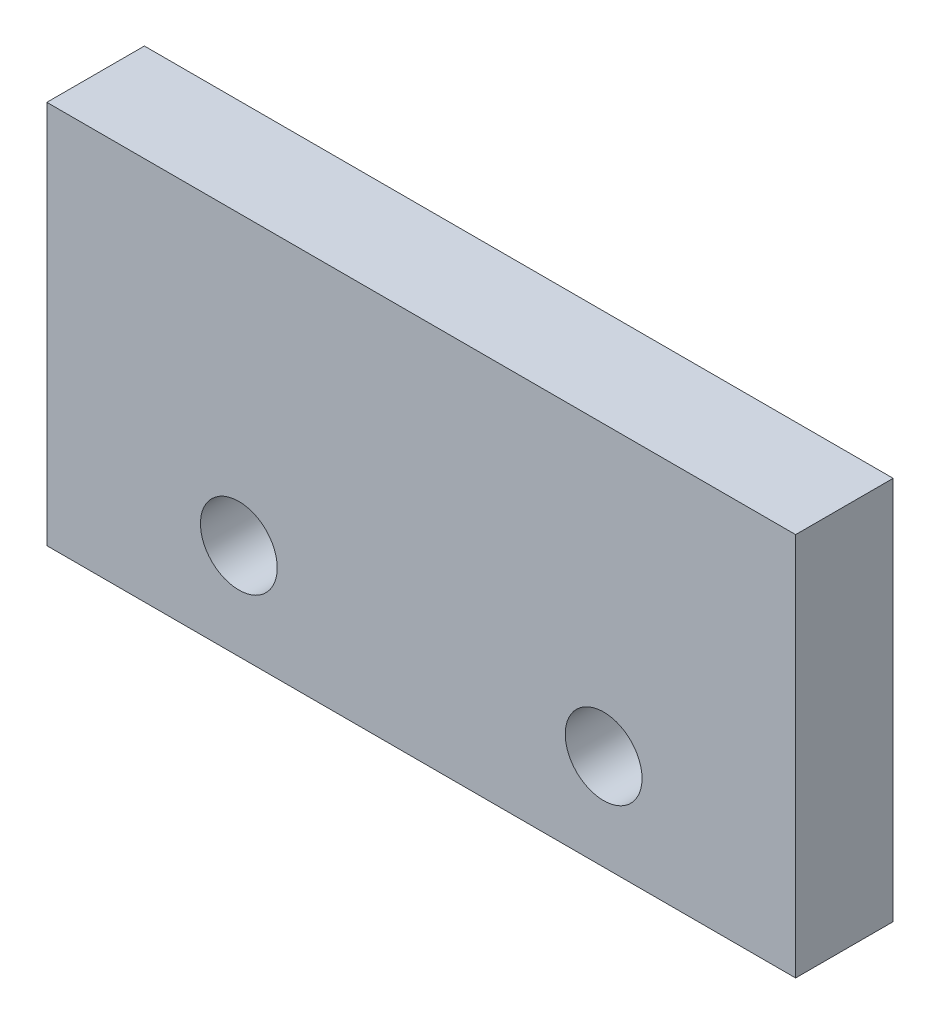
ISO-10303-21;
HEADER;
FILE_DESCRIPTION(('STEP AP214'),'2;1');
FILE_NAME('part.step','',(''),(''),'','','');
FILE_SCHEMA(('AUTOMOTIVE_DESIGN { 1 0 10303 214 1 1 1 1 }'));
ENDSEC;
DATA;
#1=APPLICATION_CONTEXT('core data for automotive mechanical design processes');
#2=APPLICATION_PROTOCOL_DEFINITION('international standard','automotive_design',2000,#1);
#3=PRODUCT_CONTEXT('',#1,'mechanical');
#4=PRODUCT('Part','Part','',(#3));
#5=PRODUCT_RELATED_PRODUCT_CATEGORY('part','',(#4));
#6=PRODUCT_DEFINITION_FORMATION('','',#4);
#7=PRODUCT_DEFINITION_CONTEXT('part definition',#1,'design');
#8=PRODUCT_DEFINITION('design','',#6,#7);
#9=PRODUCT_DEFINITION_SHAPE('','',#8);
#10=(LENGTH_UNIT() NAMED_UNIT(*) SI_UNIT(.MILLI.,.METRE.));
#11=(NAMED_UNIT(*) PLANE_ANGLE_UNIT() SI_UNIT($,.RADIAN.));
#12=(NAMED_UNIT(*) SI_UNIT($,.STERADIAN.) SOLID_ANGLE_UNIT());
#13=UNCERTAINTY_MEASURE_WITH_UNIT(LENGTH_MEASURE(1.E-05),#10,'distance_accuracy_value','');
#14=(GEOMETRIC_REPRESENTATION_CONTEXT(3) GLOBAL_UNCERTAINTY_ASSIGNED_CONTEXT((#13)) GLOBAL_UNIT_ASSIGNED_CONTEXT((#10,
#11,#12)) REPRESENTATION_CONTEXT('',''));
#15=CARTESIAN_POINT('',(0.,0.,0.));
#16=DIRECTION('',(0.,0.,1.));
#17=DIRECTION('',(1.,0.,0.));
#18=AXIS2_PLACEMENT_3D('',#15,#16,#17);
#19=CARTESIAN_POINT('',(0.,0.,1.27));
#20=DIRECTION('',(0.,0.,-1.));
#21=DIRECTION('',(-1.,0.,0.));
#22=AXIS2_PLACEMENT_3D('',#19,#20,#21);
#23=PLANE('',#22);
#24=DIRECTION('',(0.,1.,0.));
#25=VECTOR('',#24,1.);
#26=CARTESIAN_POINT('',(9.75,-5.,1.27));
#27=LINE('',#26,#25);
#28=CARTESIAN_POINT('',(9.75,-5.,1.27));
#29=VERTEX_POINT('',#28);
#30=CARTESIAN_POINT('',(9.75,5.,1.27));
#31=VERTEX_POINT('',#30);
#32=EDGE_CURVE('E91',#29,#31,#27,.T.);
#33=ORIENTED_EDGE('',*,*,#32,.T.);
#34=DIRECTION('',(-1.,0.,0.));
#35=VECTOR('',#34,1.);
#36=CARTESIAN_POINT('',(-9.75,5.,1.27));
#37=LINE('',#36,#35);
#38=CARTESIAN_POINT('',(-9.75,5.,1.27));
#39=VERTEX_POINT('',#38);
#40=EDGE_CURVE('E86',#31,#39,#37,.T.);
#41=ORIENTED_EDGE('',*,*,#40,.T.);
#42=DIRECTION('',(0.,-1.,0.));
#43=VECTOR('',#42,1.);
#44=CARTESIAN_POINT('',(-9.75,-5.,1.27));
#45=LINE('',#44,#43);
#46=CARTESIAN_POINT('',(-9.75,-5.,1.27));
#47=VERTEX_POINT('',#46);
#48=EDGE_CURVE('E89',#39,#47,#45,.T.);
#49=ORIENTED_EDGE('',*,*,#48,.T.);
#50=DIRECTION('',(1.,0.,0.));
#51=VECTOR('',#50,1.);
#52=CARTESIAN_POINT('',(-9.75,-5.,1.27));
#53=LINE('',#52,#51);
#54=EDGE_CURVE('E56',#47,#29,#53,.T.);
#55=ORIENTED_EDGE('',*,*,#54,.T.);
#56=EDGE_LOOP('',(#33,#41,#49,#55));
#57=FACE_BOUND('',#56,.T.);
#58=CARTESIAN_POINT('',(-4.75,-2.5,1.27));
#59=DIRECTION('',(0.,0.,1.));
#60=DIRECTION('',(1.,0.,0.));
#61=AXIS2_PLACEMENT_3D('',#58,#59,#60);
#62=CIRCLE('',#61,1.);
#63=CARTESIAN_POINT('',(-3.75,-2.5,1.27));
#64=VERTEX_POINT('',#63);
#65=EDGE_CURVE('E106',#64,#64,#62,.T.);
#66=ORIENTED_EDGE('',*,*,#65,.F.);
#67=EDGE_LOOP('',(#66));
#68=FACE_BOUND('',#67,.T.);
#69=CARTESIAN_POINT('',(4.75,-2.5,1.27));
#70=DIRECTION('',(0.,0.,1.));
#71=DIRECTION('',(1.,0.,0.));
#72=AXIS2_PLACEMENT_3D('',#69,#70,#71);
#73=CIRCLE('',#72,1.);
#74=CARTESIAN_POINT('',(5.75,-2.5,1.27));
#75=VERTEX_POINT('',#74);
#76=EDGE_CURVE('E121',#75,#75,#73,.T.);
#77=ORIENTED_EDGE('',*,*,#76,.F.);
#78=EDGE_LOOP('',(#77));
#79=FACE_BOUND('',#78,.T.);
#80=ADVANCED_FACE('F39',(#57,#68,#79),#23,.F.);
#81=CARTESIAN_POINT('',(0.,0.,-1.27));
#82=DIRECTION('',(0.,0.,-1.));
#83=DIRECTION('',(-1.,0.,0.));
#84=AXIS2_PLACEMENT_3D('',#81,#82,#83);
#85=PLANE('',#84);
#86=CARTESIAN_POINT('',(-4.75,-2.5,-1.27));
#87=DIRECTION('',(0.,0.,1.));
#88=DIRECTION('',(1.,0.,0.));
#89=AXIS2_PLACEMENT_3D('',#86,#87,#88);
#90=CIRCLE('',#89,1.);
#91=CARTESIAN_POINT('',(-3.75,-2.5,-1.27));
#92=VERTEX_POINT('',#91);
#93=EDGE_CURVE('E118',#92,#92,#90,.T.);
#94=ORIENTED_EDGE('',*,*,#93,.T.);
#95=EDGE_LOOP('',(#94));
#96=FACE_BOUND('',#95,.T.);
#97=DIRECTION('',(0.,1.,0.));
#98=VECTOR('',#97,1.);
#99=CARTESIAN_POINT('',(9.75,-5.,-1.27));
#100=LINE('',#99,#98);
#101=CARTESIAN_POINT('',(9.75,-5.,-1.27));
#102=VERTEX_POINT('',#101);
#103=CARTESIAN_POINT('',(9.75,5.,-1.27));
#104=VERTEX_POINT('',#103);
#105=EDGE_CURVE('E103',#102,#104,#100,.T.);
#106=ORIENTED_EDGE('',*,*,#105,.F.);
#107=DIRECTION('',(1.,0.,0.));
#108=VECTOR('',#107,1.);
#109=CARTESIAN_POINT('',(-9.75,-5.,-1.27));
#110=LINE('',#109,#108);
#111=CARTESIAN_POINT('',(-9.75,-5.,-1.27));
#112=VERTEX_POINT('',#111);
#113=EDGE_CURVE('E79',#112,#102,#110,.T.);
#114=ORIENTED_EDGE('',*,*,#113,.F.);
#115=DIRECTION('',(0.,-1.,0.));
#116=VECTOR('',#115,1.);
#117=CARTESIAN_POINT('',(-9.75,-5.,-1.27));
#118=LINE('',#117,#116);
#119=CARTESIAN_POINT('',(-9.75,5.,-1.27));
#120=VERTEX_POINT('',#119);
#121=EDGE_CURVE('E73',#120,#112,#118,.T.);
#122=ORIENTED_EDGE('',*,*,#121,.F.);
#123=DIRECTION('',(-1.,0.,0.));
#124=VECTOR('',#123,1.);
#125=CARTESIAN_POINT('',(-9.75,5.,-1.27));
#126=LINE('',#125,#124);
#127=EDGE_CURVE('E95',#104,#120,#126,.T.);
#128=ORIENTED_EDGE('',*,*,#127,.F.);
#129=EDGE_LOOP('',(#106,#114,#122,#128));
#130=FACE_BOUND('',#129,.T.);
#131=CARTESIAN_POINT('',(4.75,-2.5,-1.27));
#132=DIRECTION('',(0.,0.,1.));
#133=DIRECTION('',(1.,0.,0.));
#134=AXIS2_PLACEMENT_3D('',#131,#132,#133);
#135=CIRCLE('',#134,1.);
#136=CARTESIAN_POINT('',(5.75,-2.5,-1.27));
#137=VERTEX_POINT('',#136);
#138=EDGE_CURVE('E124',#137,#137,#135,.T.);
#139=ORIENTED_EDGE('',*,*,#138,.T.);
#140=EDGE_LOOP('',(#139));
#141=FACE_BOUND('',#140,.T.);
#142=ADVANCED_FACE('F114',(#96,#130,#141),#85,.T.);
#143=CARTESIAN_POINT('',(9.75,-5.,1.27));
#144=DIRECTION('',(-1.,0.,0.));
#145=DIRECTION('',(0.,0.,1.));
#146=AXIS2_PLACEMENT_3D('',#143,#144,#145);
#147=PLANE('',#146);
#148=ORIENTED_EDGE('',*,*,#105,.T.);
#149=DIRECTION('',(0.,0.,-1.));
#150=VECTOR('',#149,1.);
#151=CARTESIAN_POINT('',(9.75,5.,1.27));
#152=LINE('',#151,#150);
#153=EDGE_CURVE('E11',#31,#104,#152,.T.);
#154=ORIENTED_EDGE('',*,*,#153,.F.);
#155=ORIENTED_EDGE('',*,*,#32,.F.);
#156=DIRECTION('',(0.,0.,-1.));
#157=VECTOR('',#156,1.);
#158=CARTESIAN_POINT('',(9.75,-5.,1.27));
#159=LINE('',#158,#157);
#160=EDGE_CURVE('E99',#29,#102,#159,.T.);
#161=ORIENTED_EDGE('',*,*,#160,.T.);
#162=EDGE_LOOP('',(#148,#154,#155,#161));
#163=FACE_BOUND('',#162,.T.);
#164=ADVANCED_FACE('F41',(#163),#147,.F.);
#165=CARTESIAN_POINT('',(-9.75,5.,1.27));
#166=DIRECTION('',(0.,-1.,0.));
#167=DIRECTION('',(0.,0.,-1.));
#168=AXIS2_PLACEMENT_3D('',#165,#166,#167);
#169=PLANE('',#168);
#170=ORIENTED_EDGE('',*,*,#127,.T.);
#171=DIRECTION('',(0.,0.,-1.));
#172=VECTOR('',#171,1.);
#173=CARTESIAN_POINT('',(-9.75,5.,1.27));
#174=LINE('',#173,#172);
#175=EDGE_CURVE('E48',#39,#120,#174,.T.);
#176=ORIENTED_EDGE('',*,*,#175,.F.);
#177=ORIENTED_EDGE('',*,*,#40,.F.);
#178=ORIENTED_EDGE('',*,*,#153,.T.);
#179=EDGE_LOOP('',(#170,#176,#177,#178));
#180=FACE_BOUND('',#179,.T.);
#181=ADVANCED_FACE('F94',(#180),#169,.F.);
#182=CARTESIAN_POINT('',(-9.75,-5.,1.27));
#183=DIRECTION('',(1.,0.,0.));
#184=DIRECTION('',(0.,0.,-1.));
#185=AXIS2_PLACEMENT_3D('',#182,#183,#184);
#186=PLANE('',#185);
#187=ORIENTED_EDGE('',*,*,#121,.T.);
#188=DIRECTION('',(0.,0.,-1.));
#189=VECTOR('',#188,1.);
#190=CARTESIAN_POINT('',(-9.75,-5.,1.27));
#191=LINE('',#190,#189);
#192=EDGE_CURVE('E96',#47,#112,#191,.T.);
#193=ORIENTED_EDGE('',*,*,#192,.F.);
#194=ORIENTED_EDGE('',*,*,#48,.F.);
#195=ORIENTED_EDGE('',*,*,#175,.T.);
#196=EDGE_LOOP('',(#187,#193,#194,#195));
#197=FACE_BOUND('',#196,.T.);
#198=ADVANCED_FACE('F97',(#197),#186,.F.);
#199=CARTESIAN_POINT('',(-9.75,-5.,1.27));
#200=DIRECTION('',(0.,1.,0.));
#201=DIRECTION('',(0.,0.,1.));
#202=AXIS2_PLACEMENT_3D('',#199,#200,#201);
#203=PLANE('',#202);
#204=ORIENTED_EDGE('',*,*,#113,.T.);
#205=ORIENTED_EDGE('',*,*,#160,.F.);
#206=ORIENTED_EDGE('',*,*,#54,.F.);
#207=ORIENTED_EDGE('',*,*,#192,.T.);
#208=EDGE_LOOP('',(#204,#205,#206,#207));
#209=FACE_BOUND('',#208,.T.);
#210=ADVANCED_FACE('F111',(#209),#203,.F.);
#211=CARTESIAN_POINT('',(-4.75,-2.5,1.27));
#212=DIRECTION('',(0.,0.,-1.));
#213=DIRECTION('',(-1.,0.,0.));
#214=AXIS2_PLACEMENT_3D('',#211,#212,#213);
#215=CYLINDRICAL_SURFACE('',#214,1.);
#216=ORIENTED_EDGE('',*,*,#65,.T.);
#217=EDGE_LOOP('',(#216));
#218=FACE_BOUND('',#217,.T.);
#219=ORIENTED_EDGE('',*,*,#93,.F.);
#220=EDGE_LOOP('',(#219));
#221=FACE_BOUND('',#220,.T.);
#222=ADVANCED_FACE('F141',(#218,#221),#215,.F.);
#223=CARTESIAN_POINT('',(4.75,-2.5,1.27));
#224=DIRECTION('',(0.,0.,-1.));
#225=DIRECTION('',(-1.,0.,0.));
#226=AXIS2_PLACEMENT_3D('',#223,#224,#225);
#227=CYLINDRICAL_SURFACE('',#226,1.);
#228=ORIENTED_EDGE('',*,*,#76,.T.);
#229=EDGE_LOOP('',(#228));
#230=FACE_BOUND('',#229,.T.);
#231=ORIENTED_EDGE('',*,*,#138,.F.);
#232=EDGE_LOOP('',(#231));
#233=FACE_BOUND('',#232,.T.);
#234=ADVANCED_FACE('F130',(#230,#233),#227,.F.);
#235=CLOSED_SHELL('',(#80,#142,#164,#181,#198,#210,#222,#234));
#236=MANIFOLD_SOLID_BREP('B2',#235);
#237=ADVANCED_BREP_SHAPE_REPRESENTATION('',(#18,#236),#14);
#238=SHAPE_DEFINITION_REPRESENTATION(#9,#237);
ENDSEC;
END-ISO-10303-21;
